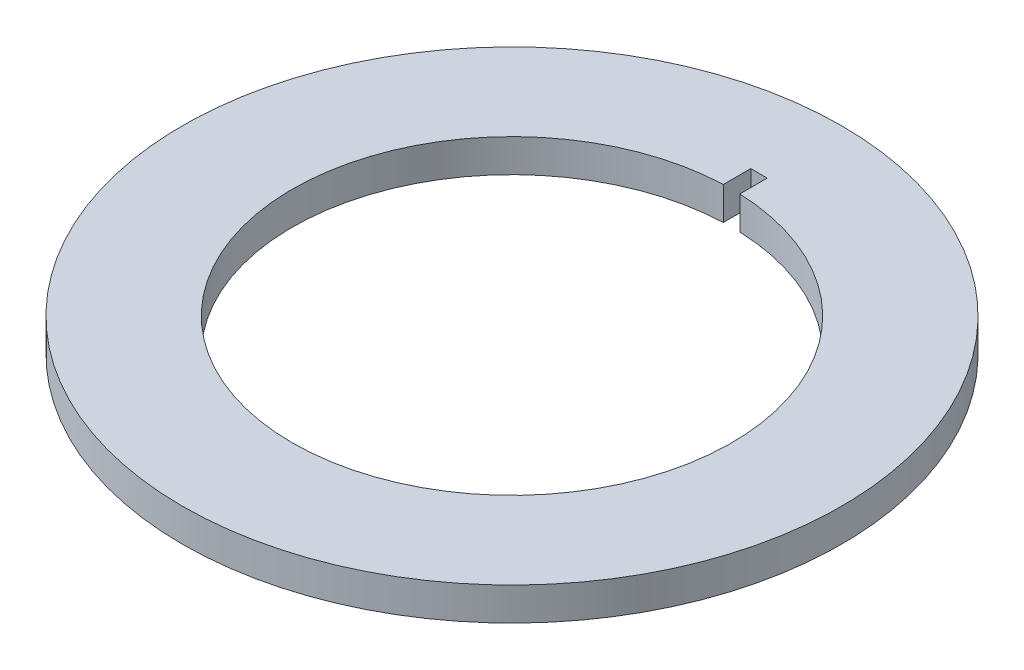
ISO-10303-21;
HEADER;
FILE_DESCRIPTION(('STEP AP214'),'2;1');
FILE_NAME('part.step','',(''),(''),'','','');
FILE_SCHEMA(('AUTOMOTIVE_DESIGN { 1 0 10303 214 1 1 1 1 }'));
ENDSEC;
DATA;
#1=APPLICATION_CONTEXT('core data for automotive mechanical design processes');
#2=APPLICATION_PROTOCOL_DEFINITION('international standard','automotive_design',2000,#1);
#3=PRODUCT_CONTEXT('',#1,'mechanical');
#4=PRODUCT('Part','Part','',(#3));
#5=PRODUCT_RELATED_PRODUCT_CATEGORY('part','',(#4));
#6=PRODUCT_DEFINITION_FORMATION('','',#4);
#7=PRODUCT_DEFINITION_CONTEXT('part definition',#1,'design');
#8=PRODUCT_DEFINITION('design','',#6,#7);
#9=PRODUCT_DEFINITION_SHAPE('','',#8);
#10=(LENGTH_UNIT() NAMED_UNIT(*) SI_UNIT(.MILLI.,.METRE.));
#11=(NAMED_UNIT(*) PLANE_ANGLE_UNIT() SI_UNIT($,.RADIAN.));
#12=(NAMED_UNIT(*) SI_UNIT($,.STERADIAN.) SOLID_ANGLE_UNIT());
#13=UNCERTAINTY_MEASURE_WITH_UNIT(LENGTH_MEASURE(1.E-05),#10,'distance_accuracy_value','');
#14=(GEOMETRIC_REPRESENTATION_CONTEXT(3) GLOBAL_UNCERTAINTY_ASSIGNED_CONTEXT((#13)) GLOBAL_UNIT_ASSIGNED_CONTEXT((#10,
#11,#12)) REPRESENTATION_CONTEXT('',''));
#15=CARTESIAN_POINT('',(0.,0.,0.));
#16=DIRECTION('',(0.,0.,1.));
#17=DIRECTION('',(1.,0.,0.));
#18=AXIS2_PLACEMENT_3D('',#15,#16,#17);
#19=CARTESIAN_POINT('',(0.,3.,0.));
#20=DIRECTION('',(0.,1.,0.));
#21=DIRECTION('',(0.,0.,1.));
#22=AXIS2_PLACEMENT_3D('',#19,#20,#21);
#23=PLANE('',#22);
#24=CARTESIAN_POINT('',(0.,3.,0.));
#25=DIRECTION('',(0.,1.,0.));
#26=DIRECTION('',(0.,0.,1.));
#27=AXIS2_PLACEMENT_3D('',#24,#25,#26);
#28=CIRCLE('',#27,30.);
#29=CARTESIAN_POINT('',(0.,3.,30.));
#30=VERTEX_POINT('',#29);
#31=EDGE_CURVE('E11',#30,#30,#28,.T.);
#32=ORIENTED_EDGE('',*,*,#31,.T.);
#33=EDGE_LOOP('',(#32));
#34=FACE_BOUND('',#33,.T.);
#35=DIRECTION('',(-1.,0.,0.));
#36=VECTOR('',#35,1.);
#37=CARTESIAN_POINT('',(0.75,3.,-22.4874965258474));
#38=LINE('',#37,#36);
#39=CARTESIAN_POINT('',(0.75,3.,-22.4874965258474));
#40=VERTEX_POINT('',#39);
#41=CARTESIAN_POINT('',(-0.75,3.,-22.4874965258474));
#42=VERTEX_POINT('',#41);
#43=EDGE_CURVE('E85',#40,#42,#38,.T.);
#44=ORIENTED_EDGE('',*,*,#43,.F.);
#45=DIRECTION('',(0.,0.,-1.));
#46=VECTOR('',#45,1.);
#47=CARTESIAN_POINT('',(0.75,3.,-22.4874965258474));
#48=LINE('',#47,#46);
#49=CARTESIAN_POINT('',(0.750000000000013,3.,-19.9859325526731));
#50=VERTEX_POINT('',#49);
#51=EDGE_CURVE('E77',#50,#40,#48,.T.);
#52=ORIENTED_EDGE('',*,*,#51,.F.);
#53=CARTESIAN_POINT('',(0.,3.,0.));
#54=DIRECTION('',(0.,1.,0.));
#55=DIRECTION('',(0.,0.,1.));
#56=AXIS2_PLACEMENT_3D('',#53,#54,#55);
#57=CIRCLE('',#56,20.);
#58=CARTESIAN_POINT('',(-0.75,3.,-19.9859325526731));
#59=VERTEX_POINT('',#58);
#60=EDGE_CURVE('E98',#59,#50,#57,.T.);
#61=ORIENTED_EDGE('',*,*,#60,.F.);
#62=DIRECTION('',(0.,0.,1.));
#63=VECTOR('',#62,1.);
#64=CARTESIAN_POINT('',(-0.75,3.,-22.4874965258474));
#65=LINE('',#64,#63);
#66=EDGE_CURVE('E96',#42,#59,#65,.T.);
#67=ORIENTED_EDGE('',*,*,#66,.F.);
#68=EDGE_LOOP('',(#44,#52,#61,#67));
#69=FACE_BOUND('',#68,.T.);
#70=ADVANCED_FACE('F36',(#34,#69),#23,.T.);
#71=CARTESIAN_POINT('',(0.,0.,0.));
#72=DIRECTION('',(0.,1.,0.));
#73=DIRECTION('',(0.,0.,1.));
#74=AXIS2_PLACEMENT_3D('',#71,#72,#73);
#75=PLANE('',#74);
#76=CARTESIAN_POINT('',(0.,0.,0.));
#77=DIRECTION('',(0.,1.,0.));
#78=DIRECTION('',(0.,0.,1.));
#79=AXIS2_PLACEMENT_3D('',#76,#77,#78);
#80=CIRCLE('',#79,30.);
#81=CARTESIAN_POINT('',(0.,0.,30.));
#82=VERTEX_POINT('',#81);
#83=EDGE_CURVE('E40',#82,#82,#80,.T.);
#84=ORIENTED_EDGE('',*,*,#83,.F.);
#85=EDGE_LOOP('',(#84));
#86=FACE_BOUND('',#85,.T.);
#87=DIRECTION('',(0.,0.,-1.));
#88=VECTOR('',#87,1.);
#89=CARTESIAN_POINT('',(0.75,0.,-22.4874965258474));
#90=LINE('',#89,#88);
#91=CARTESIAN_POINT('',(0.750000000000013,0.,-19.9859325526731));
#92=VERTEX_POINT('',#91);
#93=CARTESIAN_POINT('',(0.75,0.,-22.4874965258474));
#94=VERTEX_POINT('',#93);
#95=EDGE_CURVE('E59',#92,#94,#90,.T.);
#96=ORIENTED_EDGE('',*,*,#95,.T.);
#97=DIRECTION('',(-1.,0.,0.));
#98=VECTOR('',#97,1.);
#99=CARTESIAN_POINT('',(0.75,0.,-22.4874965258474));
#100=LINE('',#99,#98);
#101=CARTESIAN_POINT('',(-0.75,0.,-22.4874965258474));
#102=VERTEX_POINT('',#101);
#103=EDGE_CURVE('E92',#94,#102,#100,.T.);
#104=ORIENTED_EDGE('',*,*,#103,.T.);
#105=DIRECTION('',(0.,0.,1.));
#106=VECTOR('',#105,1.);
#107=CARTESIAN_POINT('',(-0.75,0.,-22.4874965258474));
#108=LINE('',#107,#106);
#109=CARTESIAN_POINT('',(-0.75,0.,-19.9859325526731));
#110=VERTEX_POINT('',#109);
#111=EDGE_CURVE('E104',#102,#110,#108,.T.);
#112=ORIENTED_EDGE('',*,*,#111,.T.);
#113=CARTESIAN_POINT('',(0.,0.,0.));
#114=DIRECTION('',(0.,1.,0.));
#115=DIRECTION('',(0.,0.,1.));
#116=AXIS2_PLACEMENT_3D('',#113,#114,#115);
#117=CIRCLE('',#116,20.);
#118=EDGE_CURVE('E86',#110,#92,#117,.T.);
#119=ORIENTED_EDGE('',*,*,#118,.T.);
#120=EDGE_LOOP('',(#96,#104,#112,#119));
#121=FACE_BOUND('',#120,.T.);
#122=ADVANCED_FACE('F115',(#86,#121),#75,.F.);
#123=CARTESIAN_POINT('',(0.,3.,0.));
#124=DIRECTION('',(0.,-1.,0.));
#125=DIRECTION('',(0.,0.,-1.));
#126=AXIS2_PLACEMENT_3D('',#123,#124,#125);
#127=CYLINDRICAL_SURFACE('',#126,30.);
#128=ORIENTED_EDGE('',*,*,#31,.F.);
#129=EDGE_LOOP('',(#128));
#130=FACE_BOUND('',#129,.T.);
#131=ORIENTED_EDGE('',*,*,#83,.T.);
#132=EDGE_LOOP('',(#131));
#133=FACE_BOUND('',#132,.T.);
#134=ADVANCED_FACE('F38',(#130,#133),#127,.T.);
#135=CARTESIAN_POINT('',(0.75,3.,-22.4874965258474));
#136=DIRECTION('',(-1.,0.,0.));
#137=DIRECTION('',(0.,0.,1.));
#138=AXIS2_PLACEMENT_3D('',#135,#136,#137);
#139=PLANE('',#138);
#140=ORIENTED_EDGE('',*,*,#95,.F.);
#141=DIRECTION('',(0.,-1.,0.));
#142=VECTOR('',#141,1.);
#143=CARTESIAN_POINT('',(0.750000000000013,3.,-19.9859325526731));
#144=LINE('',#143,#142);
#145=EDGE_CURVE('E81',#50,#92,#144,.T.);
#146=ORIENTED_EDGE('',*,*,#145,.F.);
#147=ORIENTED_EDGE('',*,*,#51,.T.);
#148=DIRECTION('',(0.,-1.,0.));
#149=VECTOR('',#148,1.);
#150=CARTESIAN_POINT('',(0.75,3.,-22.4874965258474));
#151=LINE('',#150,#149);
#152=EDGE_CURVE('E80',#40,#94,#151,.T.);
#153=ORIENTED_EDGE('',*,*,#152,.T.);
#154=EDGE_LOOP('',(#140,#146,#147,#153));
#155=FACE_BOUND('',#154,.T.);
#156=ADVANCED_FACE('F79',(#155),#139,.T.);
#157=CARTESIAN_POINT('',(0.75,3.,-22.4874965258474));
#158=DIRECTION('',(0.,0.,1.));
#159=DIRECTION('',(1.,0.,0.));
#160=AXIS2_PLACEMENT_3D('',#157,#158,#159);
#161=PLANE('',#160);
#162=ORIENTED_EDGE('',*,*,#103,.F.);
#163=ORIENTED_EDGE('',*,*,#152,.F.);
#164=ORIENTED_EDGE('',*,*,#43,.T.);
#165=DIRECTION('',(0.,-1.,0.));
#166=VECTOR('',#165,1.);
#167=CARTESIAN_POINT('',(-0.75,3.,-22.4874965258474));
#168=LINE('',#167,#166);
#169=EDGE_CURVE('E93',#42,#102,#168,.T.);
#170=ORIENTED_EDGE('',*,*,#169,.T.);
#171=EDGE_LOOP('',(#162,#163,#164,#170));
#172=FACE_BOUND('',#171,.T.);
#173=ADVANCED_FACE('F89',(#172),#161,.T.);
#174=CARTESIAN_POINT('',(-0.75,3.,-22.4874965258474));
#175=DIRECTION('',(1.,0.,0.));
#176=DIRECTION('',(0.,0.,-1.));
#177=AXIS2_PLACEMENT_3D('',#174,#175,#176);
#178=PLANE('',#177);
#179=ORIENTED_EDGE('',*,*,#111,.F.);
#180=ORIENTED_EDGE('',*,*,#169,.F.);
#181=ORIENTED_EDGE('',*,*,#66,.T.);
#182=DIRECTION('',(0.,-1.,0.));
#183=VECTOR('',#182,1.);
#184=CARTESIAN_POINT('',(-0.75,3.,-19.9859325526731));
#185=LINE('',#184,#183);
#186=EDGE_CURVE('E51',#59,#110,#185,.T.);
#187=ORIENTED_EDGE('',*,*,#186,.T.);
#188=EDGE_LOOP('',(#179,#180,#181,#187));
#189=FACE_BOUND('',#188,.T.);
#190=ADVANCED_FACE('F113',(#189),#178,.T.);
#191=CARTESIAN_POINT('',(0.,3.,0.));
#192=DIRECTION('',(0.,-1.,0.));
#193=DIRECTION('',(0.,0.,-1.));
#194=AXIS2_PLACEMENT_3D('',#191,#192,#193);
#195=CYLINDRICAL_SURFACE('',#194,20.);
#196=ORIENTED_EDGE('',*,*,#118,.F.);
#197=ORIENTED_EDGE('',*,*,#186,.F.);
#198=ORIENTED_EDGE('',*,*,#60,.T.);
#199=ORIENTED_EDGE('',*,*,#145,.T.);
#200=EDGE_LOOP('',(#196,#197,#198,#199));
#201=FACE_BOUND('',#200,.T.);
#202=ADVANCED_FACE('F116',(#201),#195,.F.);
#203=CLOSED_SHELL('',(#70,#122,#134,#156,#173,#190,#202));
#204=MANIFOLD_SOLID_BREP('B2',#203);
#205=ADVANCED_BREP_SHAPE_REPRESENTATION('',(#18,#204),#14);
#206=SHAPE_DEFINITION_REPRESENTATION(#9,#205);
ENDSEC;
END-ISO-10303-21;
